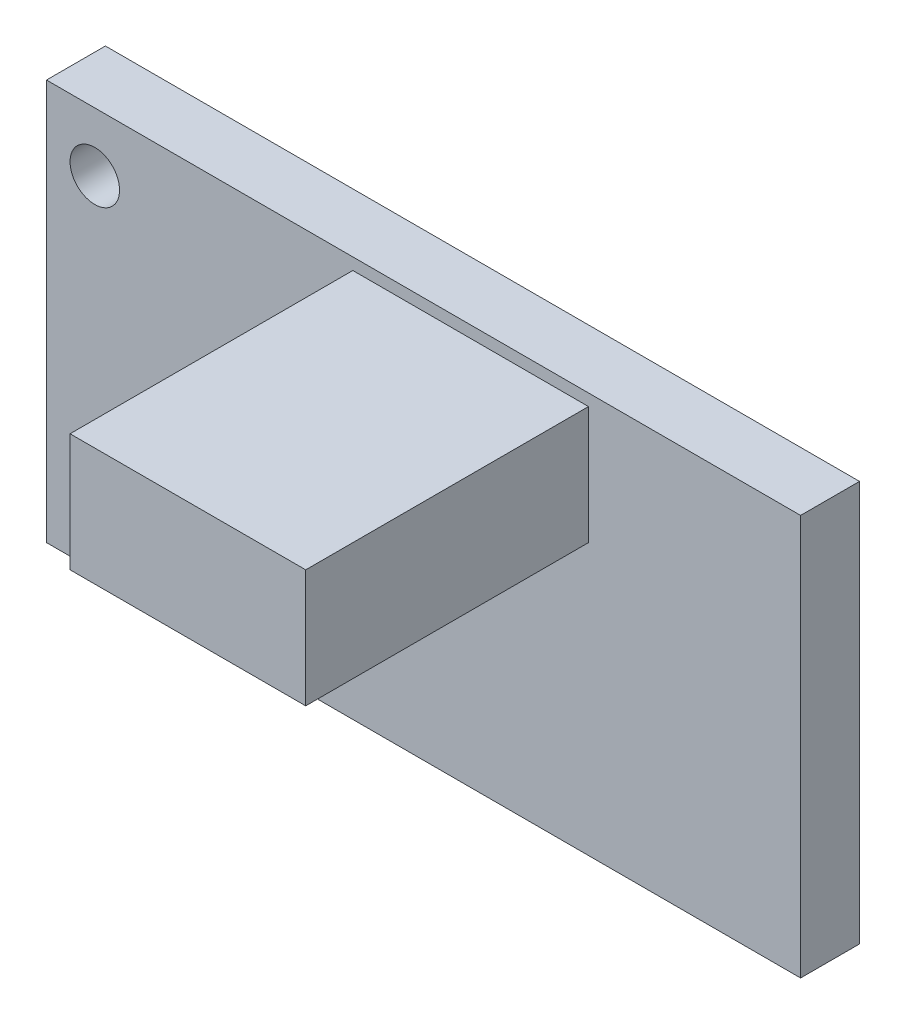
ISO-10303-21;
HEADER;
FILE_DESCRIPTION(('STEP AP214'),'2;1');
FILE_NAME('part.step','',(''),(''),'','','');
FILE_SCHEMA(('AUTOMOTIVE_DESIGN { 1 0 10303 214 1 1 1 1 }'));
ENDSEC;
DATA;
#1=APPLICATION_CONTEXT('core data for automotive mechanical design processes');
#2=APPLICATION_PROTOCOL_DEFINITION('international standard','automotive_design',2000,#1);
#3=PRODUCT_CONTEXT('',#1,'mechanical');
#4=PRODUCT('Part','Part','',(#3));
#5=PRODUCT_RELATED_PRODUCT_CATEGORY('part','',(#4));
#6=PRODUCT_DEFINITION_FORMATION('','',#4);
#7=PRODUCT_DEFINITION_CONTEXT('part definition',#1,'design');
#8=PRODUCT_DEFINITION('design','',#6,#7);
#9=PRODUCT_DEFINITION_SHAPE('','',#8);
#10=(LENGTH_UNIT() NAMED_UNIT(*) SI_UNIT(.MILLI.,.METRE.));
#11=(NAMED_UNIT(*) PLANE_ANGLE_UNIT() SI_UNIT($,.RADIAN.));
#12=(NAMED_UNIT(*) SI_UNIT($,.STERADIAN.) SOLID_ANGLE_UNIT());
#13=UNCERTAINTY_MEASURE_WITH_UNIT(LENGTH_MEASURE(1.E-05),#10,'distance_accuracy_value','');
#14=(GEOMETRIC_REPRESENTATION_CONTEXT(3) GLOBAL_UNCERTAINTY_ASSIGNED_CONTEXT((#13)) GLOBAL_UNIT_ASSIGNED_CONTEXT((#10,
#11,#12)) REPRESENTATION_CONTEXT('',''));
#15=CARTESIAN_POINT('',(0.,0.,0.));
#16=DIRECTION('',(0.,0.,1.));
#17=DIRECTION('',(1.,0.,0.));
#18=AXIS2_PLACEMENT_3D('',#15,#16,#17);
#19=CARTESIAN_POINT('',(0.,0.,2.5));
#20=DIRECTION('',(0.,0.,1.));
#21=DIRECTION('',(1.,0.,0.));
#22=AXIS2_PLACEMENT_3D('',#19,#20,#21);
#23=PLANE('',#22);
#24=CARTESIAN_POINT('',(2.05,-2.5,2.5));
#25=DIRECTION('',(0.,0.,1.));
#26=DIRECTION('',(1.,0.,0.));
#27=AXIS2_PLACEMENT_3D('',#24,#25,#26);
#28=CIRCLE('',#27,1.05);
#29=CARTESIAN_POINT('',(3.1,-2.5,2.5));
#30=VERTEX_POINT('',#29);
#31=EDGE_CURVE('E184',#30,#30,#28,.T.);
#32=ORIENTED_EDGE('',*,*,#31,.F.);
#33=EDGE_LOOP('',(#32));
#34=FACE_BOUND('',#33,.T.);
#35=CARTESIAN_POINT('',(2.05,-14.5,2.5));
#36=DIRECTION('',(0.,0.,1.));
#37=DIRECTION('',(1.,0.,0.));
#38=AXIS2_PLACEMENT_3D('',#35,#36,#37);
#39=CIRCLE('',#38,1.05);
#40=CARTESIAN_POINT('',(3.1,-14.5,2.5));
#41=VERTEX_POINT('',#40);
#42=EDGE_CURVE('E191',#41,#41,#39,.T.);
#43=ORIENTED_EDGE('',*,*,#42,.F.);
#44=EDGE_LOOP('',(#43));
#45=FACE_BOUND('',#44,.T.);
#46=DIRECTION('',(0.,-1.,0.));
#47=VECTOR('',#46,1.);
#48=CARTESIAN_POINT('',(0.,0.,2.5));
#49=LINE('',#48,#47);
#50=CARTESIAN_POINT('',(0.,0.,2.5));
#51=VERTEX_POINT('',#50);
#52=CARTESIAN_POINT('',(0.,-17.,2.5));
#53=VERTEX_POINT('',#52);
#54=EDGE_CURVE('E156',#51,#53,#49,.T.);
#55=ORIENTED_EDGE('',*,*,#54,.T.);
#56=DIRECTION('',(1.,0.,0.));
#57=VECTOR('',#56,1.);
#58=CARTESIAN_POINT('',(0.,-17.,2.5));
#59=LINE('',#58,#57);
#60=CARTESIAN_POINT('',(32.,-17.,2.5));
#61=VERTEX_POINT('',#60);
#62=EDGE_CURVE('E96',#53,#61,#59,.T.);
#63=ORIENTED_EDGE('',*,*,#62,.T.);
#64=DIRECTION('',(0.,1.,0.));
#65=VECTOR('',#64,1.);
#66=CARTESIAN_POINT('',(32.,0.,2.5));
#67=LINE('',#66,#65);
#68=CARTESIAN_POINT('',(32.,0.,2.5));
#69=VERTEX_POINT('',#68);
#70=EDGE_CURVE('E161',#61,#69,#67,.T.);
#71=ORIENTED_EDGE('',*,*,#70,.T.);
#72=DIRECTION('',(-1.,0.,0.));
#73=VECTOR('',#72,1.);
#74=CARTESIAN_POINT('',(0.,0.,2.5));
#75=LINE('',#74,#73);
#76=EDGE_CURVE('E68',#69,#51,#75,.T.);
#77=ORIENTED_EDGE('',*,*,#76,.T.);
#78=EDGE_LOOP('',(#55,#63,#71,#77));
#79=FACE_BOUND('',#78,.T.);
#80=DIRECTION('',(1.,0.,0.));
#81=VECTOR('',#80,1.);
#82=CARTESIAN_POINT('',(13.,-5.5,2.5));
#83=LINE('',#82,#81);
#84=CARTESIAN_POINT('',(13.,-5.5,2.5));
#85=VERTEX_POINT('',#84);
#86=CARTESIAN_POINT('',(23.,-5.5,2.5));
#87=VERTEX_POINT('',#86);
#88=EDGE_CURVE('E206',#85,#87,#83,.T.);
#89=ORIENTED_EDGE('',*,*,#88,.F.);
#90=DIRECTION('',(0.,-1.,0.));
#91=VECTOR('',#90,1.);
#92=CARTESIAN_POINT('',(13.,-0.5,2.5));
#93=LINE('',#92,#91);
#94=CARTESIAN_POINT('',(13.,-0.5,2.5));
#95=VERTEX_POINT('',#94);
#96=EDGE_CURVE('E143',#95,#85,#93,.T.);
#97=ORIENTED_EDGE('',*,*,#96,.F.);
#98=DIRECTION('',(-1.,0.,0.));
#99=VECTOR('',#98,1.);
#100=CARTESIAN_POINT('',(13.,-0.5,2.5));
#101=LINE('',#100,#99);
#102=CARTESIAN_POINT('',(23.,-0.5,2.5));
#103=VERTEX_POINT('',#102);
#104=EDGE_CURVE('E139',#103,#95,#101,.T.);
#105=ORIENTED_EDGE('',*,*,#104,.F.);
#106=DIRECTION('',(0.,1.,0.));
#107=VECTOR('',#106,1.);
#108=CARTESIAN_POINT('',(23.,-0.5,2.5));
#109=LINE('',#108,#107);
#110=EDGE_CURVE('E209',#87,#103,#109,.T.);
#111=ORIENTED_EDGE('',*,*,#110,.F.);
#112=EDGE_LOOP('',(#89,#97,#105,#111));
#113=FACE_BOUND('',#112,.T.);
#114=ADVANCED_FACE('F41',(#34,#45,#79,#113),#23,.T.);
#115=CARTESIAN_POINT('',(0.,0.,2.5));
#116=DIRECTION('',(1.,0.,0.));
#117=DIRECTION('',(0.,1.,0.));
#118=AXIS2_PLACEMENT_3D('',#115,#116,#117);
#119=PLANE('',#118);
#120=DIRECTION('',(0.,-1.,0.));
#121=VECTOR('',#120,1.);
#122=CARTESIAN_POINT('',(0.,0.,0.));
#123=LINE('',#122,#121);
#124=CARTESIAN_POINT('',(0.,0.,0.));
#125=VERTEX_POINT('',#124);
#126=CARTESIAN_POINT('',(0.,-17.,0.));
#127=VERTEX_POINT('',#126);
#128=EDGE_CURVE('E146',#125,#127,#123,.T.);
#129=ORIENTED_EDGE('',*,*,#128,.T.);
#130=DIRECTION('',(0.,0.,-1.));
#131=VECTOR('',#130,1.);
#132=CARTESIAN_POINT('',(0.,-17.,2.5));
#133=LINE('',#132,#131);
#134=EDGE_CURVE('E11',#53,#127,#133,.T.);
#135=ORIENTED_EDGE('',*,*,#134,.F.);
#136=ORIENTED_EDGE('',*,*,#54,.F.);
#137=DIRECTION('',(0.,0.,-1.));
#138=VECTOR('',#137,1.);
#139=CARTESIAN_POINT('',(0.,0.,2.5));
#140=LINE('',#139,#138);
#141=EDGE_CURVE('E165',#51,#125,#140,.T.);
#142=ORIENTED_EDGE('',*,*,#141,.T.);
#143=EDGE_LOOP('',(#129,#135,#136,#142));
#144=FACE_BOUND('',#143,.T.);
#145=ADVANCED_FACE('F43',(#144),#119,.F.);
#146=CARTESIAN_POINT('',(0.,-17.,2.5));
#147=DIRECTION('',(0.,1.,0.));
#148=DIRECTION('',(0.,0.,1.));
#149=AXIS2_PLACEMENT_3D('',#146,#147,#148);
#150=PLANE('',#149);
#151=DIRECTION('',(1.,0.,0.));
#152=VECTOR('',#151,1.);
#153=CARTESIAN_POINT('',(0.,-17.,0.));
#154=LINE('',#153,#152);
#155=CARTESIAN_POINT('',(32.,-17.,0.));
#156=VERTEX_POINT('',#155);
#157=EDGE_CURVE('E151',#127,#156,#154,.T.);
#158=ORIENTED_EDGE('',*,*,#157,.T.);
#159=DIRECTION('',(0.,0.,-1.));
#160=VECTOR('',#159,1.);
#161=CARTESIAN_POINT('',(32.,-17.,2.5));
#162=LINE('',#161,#160);
#163=EDGE_CURVE('E51',#61,#156,#162,.T.);
#164=ORIENTED_EDGE('',*,*,#163,.F.);
#165=ORIENTED_EDGE('',*,*,#62,.F.);
#166=ORIENTED_EDGE('',*,*,#134,.T.);
#167=EDGE_LOOP('',(#158,#164,#165,#166));
#168=FACE_BOUND('',#167,.T.);
#169=ADVANCED_FACE('F237',(#168),#150,.F.);
#170=CARTESIAN_POINT('',(32.,0.,2.5));
#171=DIRECTION('',(-1.,0.,0.));
#172=DIRECTION('',(0.,0.,1.));
#173=AXIS2_PLACEMENT_3D('',#170,#171,#172);
#174=PLANE('',#173);
#175=DIRECTION('',(0.,1.,0.));
#176=VECTOR('',#175,1.);
#177=CARTESIAN_POINT('',(32.,0.,0.));
#178=LINE('',#177,#176);
#179=CARTESIAN_POINT('',(32.,0.,0.));
#180=VERTEX_POINT('',#179);
#181=EDGE_CURVE('E169',#156,#180,#178,.T.);
#182=ORIENTED_EDGE('',*,*,#181,.T.);
#183=DIRECTION('',(0.,0.,-1.));
#184=VECTOR('',#183,1.);
#185=CARTESIAN_POINT('',(32.,0.,2.5));
#186=LINE('',#185,#184);
#187=EDGE_CURVE('E176',#69,#180,#186,.T.);
#188=ORIENTED_EDGE('',*,*,#187,.F.);
#189=ORIENTED_EDGE('',*,*,#70,.F.);
#190=ORIENTED_EDGE('',*,*,#163,.T.);
#191=EDGE_LOOP('',(#182,#188,#189,#190));
#192=FACE_BOUND('',#191,.T.);
#193=ADVANCED_FACE('F250',(#192),#174,.F.);
#194=CARTESIAN_POINT('',(0.,0.,2.5));
#195=DIRECTION('',(0.,-1.,0.));
#196=DIRECTION('',(0.,0.,-1.));
#197=AXIS2_PLACEMENT_3D('',#194,#195,#196);
#198=PLANE('',#197);
#199=DIRECTION('',(-1.,0.,0.));
#200=VECTOR('',#199,1.);
#201=CARTESIAN_POINT('',(0.,0.,0.));
#202=LINE('',#201,#200);
#203=EDGE_CURVE('E89',#180,#125,#202,.T.);
#204=ORIENTED_EDGE('',*,*,#203,.T.);
#205=ORIENTED_EDGE('',*,*,#141,.F.);
#206=ORIENTED_EDGE('',*,*,#76,.F.);
#207=ORIENTED_EDGE('',*,*,#187,.T.);
#208=EDGE_LOOP('',(#204,#205,#206,#207));
#209=FACE_BOUND('',#208,.T.);
#210=ADVANCED_FACE('F246',(#209),#198,.F.);
#211=CARTESIAN_POINT('',(0.,0.,0.));
#212=DIRECTION('',(0.,0.,1.));
#213=DIRECTION('',(1.,0.,0.));
#214=AXIS2_PLACEMENT_3D('',#211,#212,#213);
#215=PLANE('',#214);
#216=CARTESIAN_POINT('',(2.05,-2.5,0.));
#217=DIRECTION('',(0.,0.,1.));
#218=DIRECTION('',(1.,0.,0.));
#219=AXIS2_PLACEMENT_3D('',#216,#217,#218);
#220=CIRCLE('',#219,1.05);
#221=CARTESIAN_POINT('',(3.1,-2.5,0.));
#222=VERTEX_POINT('',#221);
#223=EDGE_CURVE('E45',#222,#222,#220,.T.);
#224=ORIENTED_EDGE('',*,*,#223,.T.);
#225=EDGE_LOOP('',(#224));
#226=FACE_BOUND('',#225,.T.);
#227=CARTESIAN_POINT('',(2.05,-14.5,0.));
#228=DIRECTION('',(0.,0.,1.));
#229=DIRECTION('',(1.,0.,0.));
#230=AXIS2_PLACEMENT_3D('',#227,#228,#229);
#231=CIRCLE('',#230,1.05);
#232=CARTESIAN_POINT('',(3.1,-14.5,0.));
#233=VERTEX_POINT('',#232);
#234=EDGE_CURVE('E181',#233,#233,#231,.T.);
#235=ORIENTED_EDGE('',*,*,#234,.T.);
#236=EDGE_LOOP('',(#235));
#237=FACE_BOUND('',#236,.T.);
#238=ORIENTED_EDGE('',*,*,#128,.F.);
#239=ORIENTED_EDGE('',*,*,#203,.F.);
#240=ORIENTED_EDGE('',*,*,#181,.F.);
#241=ORIENTED_EDGE('',*,*,#157,.F.);
#242=EDGE_LOOP('',(#238,#239,#240,#241));
#243=FACE_BOUND('',#242,.T.);
#244=ADVANCED_FACE('F243',(#226,#237,#243),#215,.F.);
#245=CARTESIAN_POINT('',(13.,-0.5,14.5));
#246=DIRECTION('',(1.,0.,0.));
#247=DIRECTION('',(0.,0.,-1.));
#248=AXIS2_PLACEMENT_3D('',#245,#246,#247);
#249=PLANE('',#248);
#250=ORIENTED_EDGE('',*,*,#96,.T.);
#251=DIRECTION('',(0.,0.,-1.));
#252=VECTOR('',#251,1.);
#253=CARTESIAN_POINT('',(13.,-5.5,14.5));
#254=LINE('',#253,#252);
#255=CARTESIAN_POINT('',(13.,-5.5,14.5));
#256=VERTEX_POINT('',#255);
#257=EDGE_CURVE('E122',#256,#85,#254,.T.);
#258=ORIENTED_EDGE('',*,*,#257,.F.);
#259=DIRECTION('',(0.,-1.,0.));
#260=VECTOR('',#259,1.);
#261=CARTESIAN_POINT('',(13.,-0.5,14.5));
#262=LINE('',#261,#260);
#263=CARTESIAN_POINT('',(13.,-0.5,14.5));
#264=VERTEX_POINT('',#263);
#265=EDGE_CURVE('E130',#264,#256,#262,.T.);
#266=ORIENTED_EDGE('',*,*,#265,.F.);
#267=DIRECTION('',(0.,0.,-1.));
#268=VECTOR('',#267,1.);
#269=CARTESIAN_POINT('',(13.,-0.5,14.5));
#270=LINE('',#269,#268);
#271=EDGE_CURVE('E203',#264,#95,#270,.T.);
#272=ORIENTED_EDGE('',*,*,#271,.T.);
#273=EDGE_LOOP('',(#250,#258,#266,#272));
#274=FACE_BOUND('',#273,.T.);
#275=ADVANCED_FACE('F141',(#274),#249,.F.);
#276=CARTESIAN_POINT('',(13.,-5.5,14.5));
#277=DIRECTION('',(0.,1.,0.));
#278=DIRECTION('',(0.,0.,1.));
#279=AXIS2_PLACEMENT_3D('',#276,#277,#278);
#280=PLANE('',#279);
#281=ORIENTED_EDGE('',*,*,#88,.T.);
#282=DIRECTION('',(0.,0.,-1.));
#283=VECTOR('',#282,1.);
#284=CARTESIAN_POINT('',(23.,-5.5,14.5));
#285=LINE('',#284,#283);
#286=CARTESIAN_POINT('',(23.,-5.5,14.5));
#287=VERTEX_POINT('',#286);
#288=EDGE_CURVE('E125',#287,#87,#285,.T.);
#289=ORIENTED_EDGE('',*,*,#288,.F.);
#290=DIRECTION('',(1.,0.,0.));
#291=VECTOR('',#290,1.);
#292=CARTESIAN_POINT('',(13.,-5.5,14.5));
#293=LINE('',#292,#291);
#294=EDGE_CURVE('E118',#256,#287,#293,.T.);
#295=ORIENTED_EDGE('',*,*,#294,.F.);
#296=ORIENTED_EDGE('',*,*,#257,.T.);
#297=EDGE_LOOP('',(#281,#289,#295,#296));
#298=FACE_BOUND('',#297,.T.);
#299=ADVANCED_FACE('F120',(#298),#280,.F.);
#300=CARTESIAN_POINT('',(23.,-0.5,14.5));
#301=DIRECTION('',(-1.,0.,0.));
#302=DIRECTION('',(0.,0.,1.));
#303=AXIS2_PLACEMENT_3D('',#300,#301,#302);
#304=PLANE('',#303);
#305=ORIENTED_EDGE('',*,*,#110,.T.);
#306=DIRECTION('',(0.,0.,-1.));
#307=VECTOR('',#306,1.);
#308=CARTESIAN_POINT('',(23.,-0.5,14.5));
#309=LINE('',#308,#307);
#310=CARTESIAN_POINT('',(23.,-0.5,14.5));
#311=VERTEX_POINT('',#310);
#312=EDGE_CURVE('E59',#311,#103,#309,.T.);
#313=ORIENTED_EDGE('',*,*,#312,.F.);
#314=DIRECTION('',(0.,1.,0.));
#315=VECTOR('',#314,1.);
#316=CARTESIAN_POINT('',(23.,-0.5,14.5));
#317=LINE('',#316,#315);
#318=EDGE_CURVE('E129',#287,#311,#317,.T.);
#319=ORIENTED_EDGE('',*,*,#318,.F.);
#320=ORIENTED_EDGE('',*,*,#288,.T.);
#321=EDGE_LOOP('',(#305,#313,#319,#320));
#322=FACE_BOUND('',#321,.T.);
#323=ADVANCED_FACE('F220',(#322),#304,.F.);
#324=CARTESIAN_POINT('',(13.,-0.5,14.5));
#325=DIRECTION('',(0.,-1.,0.));
#326=DIRECTION('',(0.,0.,-1.));
#327=AXIS2_PLACEMENT_3D('',#324,#325,#326);
#328=PLANE('',#327);
#329=ORIENTED_EDGE('',*,*,#104,.T.);
#330=ORIENTED_EDGE('',*,*,#271,.F.);
#331=DIRECTION('',(-1.,0.,0.));
#332=VECTOR('',#331,1.);
#333=CARTESIAN_POINT('',(13.,-0.5,14.5));
#334=LINE('',#333,#332);
#335=EDGE_CURVE('E134',#311,#264,#334,.T.);
#336=ORIENTED_EDGE('',*,*,#335,.F.);
#337=ORIENTED_EDGE('',*,*,#312,.T.);
#338=EDGE_LOOP('',(#329,#330,#336,#337));
#339=FACE_BOUND('',#338,.T.);
#340=ADVANCED_FACE('F221',(#339),#328,.F.);
#341=CARTESIAN_POINT('',(0.,0.,14.5));
#342=DIRECTION('',(0.,0.,1.));
#343=DIRECTION('',(1.,0.,0.));
#344=AXIS2_PLACEMENT_3D('',#341,#342,#343);
#345=PLANE('',#344);
#346=ORIENTED_EDGE('',*,*,#265,.T.);
#347=ORIENTED_EDGE('',*,*,#294,.T.);
#348=ORIENTED_EDGE('',*,*,#318,.T.);
#349=ORIENTED_EDGE('',*,*,#335,.T.);
#350=EDGE_LOOP('',(#346,#347,#348,#349));
#351=FACE_BOUND('',#350,.T.);
#352=ADVANCED_FACE('F133',(#351),#345,.T.);
#353=CARTESIAN_POINT('',(2.05,-14.5,-9.5));
#354=DIRECTION('',(0.,0.,1.));
#355=DIRECTION('',(1.,0.,0.));
#356=AXIS2_PLACEMENT_3D('',#353,#354,#355);
#357=CYLINDRICAL_SURFACE('',#356,1.05);
#358=ORIENTED_EDGE('',*,*,#42,.T.);
#359=EDGE_LOOP('',(#358));
#360=FACE_BOUND('',#359,.T.);
#361=ORIENTED_EDGE('',*,*,#234,.F.);
#362=EDGE_LOOP('',(#361));
#363=FACE_BOUND('',#362,.T.);
#364=ADVANCED_FACE('F228',(#360,#363),#357,.F.);
#365=CARTESIAN_POINT('',(2.05,-2.5,-9.5));
#366=DIRECTION('',(0.,0.,1.));
#367=DIRECTION('',(1.,0.,0.));
#368=AXIS2_PLACEMENT_3D('',#365,#366,#367);
#369=CYLINDRICAL_SURFACE('',#368,1.05);
#370=ORIENTED_EDGE('',*,*,#31,.T.);
#371=EDGE_LOOP('',(#370));
#372=FACE_BOUND('',#371,.T.);
#373=ORIENTED_EDGE('',*,*,#223,.F.);
#374=EDGE_LOOP('',(#373));
#375=FACE_BOUND('',#374,.T.);
#376=ADVANCED_FACE('F330',(#372,#375),#369,.F.);
#377=CLOSED_SHELL('',(#114,#145,#169,#193,#210,#244,#275,#299,#323,#340,#352,#364,#376));
#378=MANIFOLD_SOLID_BREP('B2',#377);
#379=ADVANCED_BREP_SHAPE_REPRESENTATION('',(#18,#378),#14);
#380=SHAPE_DEFINITION_REPRESENTATION(#9,#379);
ENDSEC;
END-ISO-10303-21;
